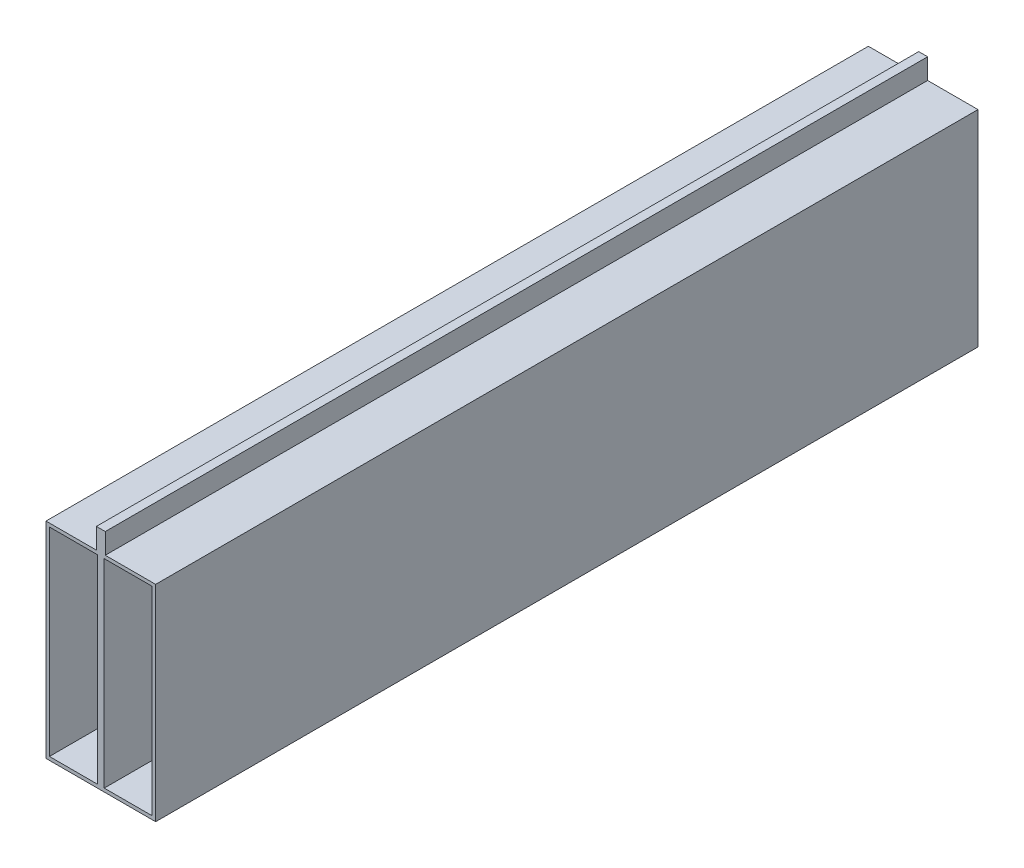
ISO-10303-21;
HEADER;
FILE_DESCRIPTION(('STEP AP214'),'2;1');
FILE_NAME('part.step','',(''),(''),'','','');
FILE_SCHEMA(('AUTOMOTIVE_DESIGN { 1 0 10303 214 1 1 1 1 }'));
ENDSEC;
DATA;
#1=APPLICATION_CONTEXT('core data for automotive mechanical design processes');
#2=APPLICATION_PROTOCOL_DEFINITION('international standard','automotive_design',2000,#1);
#3=PRODUCT_CONTEXT('',#1,'mechanical');
#4=PRODUCT('Part','Part','',(#3));
#5=PRODUCT_RELATED_PRODUCT_CATEGORY('part','',(#4));
#6=PRODUCT_DEFINITION_FORMATION('','',#4);
#7=PRODUCT_DEFINITION_CONTEXT('part definition',#1,'design');
#8=PRODUCT_DEFINITION('design','',#6,#7);
#9=PRODUCT_DEFINITION_SHAPE('','',#8);
#10=(LENGTH_UNIT() NAMED_UNIT(*) SI_UNIT(.MILLI.,.METRE.));
#11=(NAMED_UNIT(*) PLANE_ANGLE_UNIT() SI_UNIT($,.RADIAN.));
#12=(NAMED_UNIT(*) SI_UNIT($,.STERADIAN.) SOLID_ANGLE_UNIT());
#13=UNCERTAINTY_MEASURE_WITH_UNIT(LENGTH_MEASURE(1.E-05),#10,'distance_accuracy_value','');
#14=(GEOMETRIC_REPRESENTATION_CONTEXT(3) GLOBAL_UNCERTAINTY_ASSIGNED_CONTEXT((#13)) GLOBAL_UNIT_ASSIGNED_CONTEXT((#10,
#11,#12)) REPRESENTATION_CONTEXT('',''));
#15=CARTESIAN_POINT('',(0.,0.,0.));
#16=DIRECTION('',(0.,0.,1.));
#17=DIRECTION('',(1.,0.,0.));
#18=AXIS2_PLACEMENT_3D('',#15,#16,#17);
#19=CARTESIAN_POINT('',(0.,1500.,-6000.));
#20=DIRECTION('',(0.,1.,0.));
#21=DIRECTION('',(-1.,0.,0.));
#22=AXIS2_PLACEMENT_3D('',#19,#20,#21);
#23=PLANE('',#22);
#24=DIRECTION('',(-1.,0.,0.));
#25=VECTOR('',#24,1.);
#26=CARTESIAN_POINT('',(0.,1500.,-6000.));
#27=LINE('',#26,#25);
#28=CARTESIAN_POINT('',(800.,1500.,-6000.));
#29=VERTEX_POINT('',#28);
#30=CARTESIAN_POINT('',(432.5,1500.,-6000.));
#31=VERTEX_POINT('',#30);
#32=EDGE_CURVE('E257',#29,#31,#27,.T.);
#33=ORIENTED_EDGE('',*,*,#32,.T.);
#34=DIRECTION('',(0.,0.,1.));
#35=VECTOR('',#34,1.);
#36=CARTESIAN_POINT('',(432.5,1500.,-6163.47782724272));
#37=LINE('',#36,#35);
#38=CARTESIAN_POINT('',(432.5,1500.,0.));
#39=VERTEX_POINT('',#38);
#40=EDGE_CURVE('E179',#31,#39,#37,.T.);
#41=ORIENTED_EDGE('',*,*,#40,.T.);
#42=DIRECTION('',(-1.,0.,0.));
#43=VECTOR('',#42,1.);
#44=CARTESIAN_POINT('',(0.,1500.,0.));
#45=LINE('',#44,#43);
#46=CARTESIAN_POINT('',(800.,1500.,0.));
#47=VERTEX_POINT('',#46);
#48=EDGE_CURVE('E251',#47,#39,#45,.T.);
#49=ORIENTED_EDGE('',*,*,#48,.F.);
#50=DIRECTION('',(0.,0.,1.));
#51=VECTOR('',#50,1.);
#52=CARTESIAN_POINT('',(800.,1500.,-6000.));
#53=LINE('',#52,#51);
#54=EDGE_CURVE('E42',#29,#47,#53,.T.);
#55=ORIENTED_EDGE('',*,*,#54,.F.);
#56=EDGE_LOOP('',(#33,#41,#49,#55));
#57=FACE_BOUND('',#56,.T.);
#58=ADVANCED_FACE('F33',(#57),#23,.T.);
#59=CARTESIAN_POINT('',(0.,0.,-6000.));
#60=DIRECTION('',(-1.,0.,0.));
#61=DIRECTION('',(0.,0.,1.));
#62=AXIS2_PLACEMENT_3D('',#59,#60,#61);
#63=PLANE('',#62);
#64=DIRECTION('',(0.,-1.,0.));
#65=VECTOR('',#64,1.);
#66=CARTESIAN_POINT('',(0.,0.,0.));
#67=LINE('',#66,#65);
#68=CARTESIAN_POINT('',(0.,1500.,0.));
#69=VERTEX_POINT('',#68);
#70=CARTESIAN_POINT('',(0.,0.,0.));
#71=VERTEX_POINT('',#70);
#72=EDGE_CURVE('E240',#69,#71,#67,.T.);
#73=ORIENTED_EDGE('',*,*,#72,.F.);
#74=DIRECTION('',(0.,0.,1.));
#75=VECTOR('',#74,1.);
#76=CARTESIAN_POINT('',(0.,1500.,-6000.));
#77=LINE('',#76,#75);
#78=CARTESIAN_POINT('',(0.,1500.,-6000.));
#79=VERTEX_POINT('',#78);
#80=EDGE_CURVE('E11',#79,#69,#77,.T.);
#81=ORIENTED_EDGE('',*,*,#80,.F.);
#82=DIRECTION('',(0.,-1.,0.));
#83=VECTOR('',#82,1.);
#84=CARTESIAN_POINT('',(0.,0.,-6000.));
#85=LINE('',#84,#83);
#86=CARTESIAN_POINT('',(0.,0.,-6000.));
#87=VERTEX_POINT('',#86);
#88=EDGE_CURVE('E247',#79,#87,#85,.T.);
#89=ORIENTED_EDGE('',*,*,#88,.T.);
#90=DIRECTION('',(0.,0.,1.));
#91=VECTOR('',#90,1.);
#92=CARTESIAN_POINT('',(0.,0.,-6000.));
#93=LINE('',#92,#91);
#94=EDGE_CURVE('E37',#87,#71,#93,.T.);
#95=ORIENTED_EDGE('',*,*,#94,.T.);
#96=EDGE_LOOP('',(#73,#81,#89,#95));
#97=FACE_BOUND('',#96,.T.);
#98=ADVANCED_FACE('F35',(#97),#63,.T.);
#99=DIRECTION('',(0.,0.,1.));
#100=VECTOR('',#99,1.);
#101=CARTESIAN_POINT('',(367.5,1500.,-6163.47782724272));
#102=LINE('',#101,#100);
#103=CARTESIAN_POINT('',(367.5,1500.,-6000.));
#104=VERTEX_POINT('',#103);
#105=CARTESIAN_POINT('',(367.5,1500.,0.));
#106=VERTEX_POINT('',#105);
#107=EDGE_CURVE('E158',#104,#106,#102,.T.);
#108=ORIENTED_EDGE('',*,*,#107,.F.);
#109=EDGE_CURVE('E155',#104,#79,#27,.T.);
#110=ORIENTED_EDGE('',*,*,#109,.T.);
#111=ORIENTED_EDGE('',*,*,#80,.T.);
#112=EDGE_CURVE('E268',#106,#69,#45,.T.);
#113=ORIENTED_EDGE('',*,*,#112,.F.);
#114=EDGE_LOOP('',(#108,#110,#111,#113));
#115=FACE_BOUND('',#114,.T.);
#116=ADVANCED_FACE('F284',(#115),#23,.T.);
#117=CARTESIAN_POINT('',(800.,0.,-6000.));
#118=DIRECTION('',(1.,0.,0.));
#119=DIRECTION('',(0.,0.,-1.));
#120=AXIS2_PLACEMENT_3D('',#117,#118,#119);
#121=PLANE('',#120);
#122=DIRECTION('',(0.,1.,0.));
#123=VECTOR('',#122,1.);
#124=CARTESIAN_POINT('',(800.,0.,0.));
#125=LINE('',#124,#123);
#126=CARTESIAN_POINT('',(800.,0.,0.));
#127=VERTEX_POINT('',#126);
#128=EDGE_CURVE('E265',#127,#47,#125,.T.);
#129=ORIENTED_EDGE('',*,*,#128,.F.);
#130=DIRECTION('',(0.,0.,1.));
#131=VECTOR('',#130,1.);
#132=CARTESIAN_POINT('',(800.,0.,-6000.));
#133=LINE('',#132,#131);
#134=CARTESIAN_POINT('',(800.,0.,-6000.));
#135=VERTEX_POINT('',#134);
#136=EDGE_CURVE('E271',#135,#127,#133,.T.);
#137=ORIENTED_EDGE('',*,*,#136,.F.);
#138=DIRECTION('',(0.,1.,0.));
#139=VECTOR('',#138,1.);
#140=CARTESIAN_POINT('',(800.,0.,-6000.));
#141=LINE('',#140,#139);
#142=EDGE_CURVE('E254',#135,#29,#141,.T.);
#143=ORIENTED_EDGE('',*,*,#142,.T.);
#144=ORIENTED_EDGE('',*,*,#54,.T.);
#145=EDGE_LOOP('',(#129,#137,#143,#144));
#146=FACE_BOUND('',#145,.T.);
#147=ADVANCED_FACE('F288',(#146),#121,.T.);
#148=CARTESIAN_POINT('',(0.,0.,-6000.));
#149=DIRECTION('',(0.,-1.,0.));
#150=DIRECTION('',(0.,0.,-1.));
#151=AXIS2_PLACEMENT_3D('',#148,#149,#150);
#152=PLANE('',#151);
#153=DIRECTION('',(1.,0.,0.));
#154=VECTOR('',#153,1.);
#155=CARTESIAN_POINT('',(0.,0.,0.));
#156=LINE('',#155,#154);
#157=EDGE_CURVE('E262',#71,#127,#156,.T.);
#158=ORIENTED_EDGE('',*,*,#157,.F.);
#159=ORIENTED_EDGE('',*,*,#94,.F.);
#160=DIRECTION('',(1.,0.,0.));
#161=VECTOR('',#160,1.);
#162=CARTESIAN_POINT('',(0.,0.,-6000.));
#163=LINE('',#162,#161);
#164=EDGE_CURVE('E250',#87,#135,#163,.T.);
#165=ORIENTED_EDGE('',*,*,#164,.T.);
#166=ORIENTED_EDGE('',*,*,#136,.T.);
#167=EDGE_LOOP('',(#158,#159,#165,#166));
#168=FACE_BOUND('',#167,.T.);
#169=ADVANCED_FACE('F279',(#168),#152,.T.);
#170=CARTESIAN_POINT('',(0.,0.,-6000.));
#171=DIRECTION('',(0.,0.,-1.));
#172=DIRECTION('',(-1.,0.,0.));
#173=AXIS2_PLACEMENT_3D('',#170,#171,#172);
#174=PLANE('',#173);
#175=DIRECTION('',(-1.,0.,0.));
#176=VECTOR('',#175,1.);
#177=CARTESIAN_POINT('',(775.,1475.,-6000.));
#178=LINE('',#177,#176);
#179=CARTESIAN_POINT('',(775.,1475.,-6000.));
#180=VERTEX_POINT('',#179);
#181=CARTESIAN_POINT('',(425.,1475.,-6000.));
#182=VERTEX_POINT('',#181);
#183=EDGE_CURVE('E185',#180,#182,#178,.T.);
#184=ORIENTED_EDGE('',*,*,#183,.T.);
#185=DIRECTION('',(0.,-1.,0.));
#186=VECTOR('',#185,1.);
#187=CARTESIAN_POINT('',(425.,1475.,-6000.));
#188=LINE('',#187,#186);
#189=CARTESIAN_POINT('',(425.,25.,-6000.));
#190=VERTEX_POINT('',#189);
#191=EDGE_CURVE('E188',#182,#190,#188,.T.);
#192=ORIENTED_EDGE('',*,*,#191,.T.);
#193=DIRECTION('',(1.,0.,0.));
#194=VECTOR('',#193,1.);
#195=CARTESIAN_POINT('',(425.,25.,-6000.));
#196=LINE('',#195,#194);
#197=CARTESIAN_POINT('',(775.,25.,-6000.));
#198=VERTEX_POINT('',#197);
#199=EDGE_CURVE('E58',#190,#198,#196,.T.);
#200=ORIENTED_EDGE('',*,*,#199,.T.);
#201=DIRECTION('',(0.,1.,0.));
#202=VECTOR('',#201,1.);
#203=CARTESIAN_POINT('',(775.,25.,-6000.));
#204=LINE('',#203,#202);
#205=EDGE_CURVE('E193',#198,#180,#204,.T.);
#206=ORIENTED_EDGE('',*,*,#205,.T.);
#207=EDGE_LOOP('',(#184,#192,#200,#206));
#208=FACE_BOUND('',#207,.T.);
#209=DIRECTION('',(0.,-1.,0.));
#210=VECTOR('',#209,1.);
#211=CARTESIAN_POINT('',(25.,1475.,-6000.));
#212=LINE('',#211,#210);
#213=CARTESIAN_POINT('',(25.,1475.,-6000.));
#214=VERTEX_POINT('',#213);
#215=CARTESIAN_POINT('',(25.0000000000001,25.,-6000.));
#216=VERTEX_POINT('',#215);
#217=EDGE_CURVE('E215',#214,#216,#212,.T.);
#218=ORIENTED_EDGE('',*,*,#217,.T.);
#219=DIRECTION('',(1.,0.,0.));
#220=VECTOR('',#219,1.);
#221=CARTESIAN_POINT('',(25.0000000000001,25.,-6000.));
#222=LINE('',#221,#220);
#223=CARTESIAN_POINT('',(375.,25.,-6000.));
#224=VERTEX_POINT('',#223);
#225=EDGE_CURVE('E218',#216,#224,#222,.T.);
#226=ORIENTED_EDGE('',*,*,#225,.T.);
#227=DIRECTION('',(0.,1.,0.));
#228=VECTOR('',#227,1.);
#229=CARTESIAN_POINT('',(375.,1475.,-6000.));
#230=LINE('',#229,#228);
#231=CARTESIAN_POINT('',(375.,1475.,-6000.));
#232=VERTEX_POINT('',#231);
#233=EDGE_CURVE('E222',#224,#232,#230,.T.);
#234=ORIENTED_EDGE('',*,*,#233,.T.);
#235=DIRECTION('',(-1.,0.,0.));
#236=VECTOR('',#235,1.);
#237=CARTESIAN_POINT('',(25.,1475.,-6000.));
#238=LINE('',#237,#236);
#239=EDGE_CURVE('E225',#232,#214,#238,.T.);
#240=ORIENTED_EDGE('',*,*,#239,.T.);
#241=EDGE_LOOP('',(#218,#226,#234,#240));
#242=FACE_BOUND('',#241,.T.);
#243=ORIENTED_EDGE('',*,*,#88,.F.);
#244=ORIENTED_EDGE('',*,*,#109,.F.);
#245=DIRECTION('',(0.,-1.,0.));
#246=VECTOR('',#245,1.);
#247=CARTESIAN_POINT('',(367.5,1650.,-6000.));
#248=LINE('',#247,#246);
#249=CARTESIAN_POINT('',(367.5,1650.,-6000.));
#250=VERTEX_POINT('',#249);
#251=EDGE_CURVE('E148',#250,#104,#248,.T.);
#252=ORIENTED_EDGE('',*,*,#251,.F.);
#253=DIRECTION('',(-1.,0.,0.));
#254=VECTOR('',#253,1.);
#255=CARTESIAN_POINT('',(432.5,1650.,-6000.));
#256=LINE('',#255,#254);
#257=CARTESIAN_POINT('',(432.5,1650.,-6000.));
#258=VERTEX_POINT('',#257);
#259=EDGE_CURVE('E153',#258,#250,#256,.T.);
#260=ORIENTED_EDGE('',*,*,#259,.F.);
#261=DIRECTION('',(0.,1.,0.));
#262=VECTOR('',#261,1.);
#263=CARTESIAN_POINT('',(432.5,1500.,-6000.));
#264=LINE('',#263,#262);
#265=EDGE_CURVE('E178',#31,#258,#264,.T.);
#266=ORIENTED_EDGE('',*,*,#265,.F.);
#267=ORIENTED_EDGE('',*,*,#32,.F.);
#268=ORIENTED_EDGE('',*,*,#142,.F.);
#269=ORIENTED_EDGE('',*,*,#164,.F.);
#270=EDGE_LOOP('',(#243,#244,#252,#260,#266,#267,#268,#269));
#271=FACE_BOUND('',#270,.T.);
#272=ADVANCED_FACE('F151',(#208,#242,#271),#174,.T.);
#273=CARTESIAN_POINT('',(0.,0.,0.));
#274=DIRECTION('',(0.,0.,-1.));
#275=DIRECTION('',(-1.,0.,0.));
#276=AXIS2_PLACEMENT_3D('',#273,#274,#275);
#277=PLANE('',#276);
#278=DIRECTION('',(0.,-1.,0.));
#279=VECTOR('',#278,1.);
#280=CARTESIAN_POINT('',(425.,1475.,0.));
#281=LINE('',#280,#279);
#282=CARTESIAN_POINT('',(425.,1475.,0.));
#283=VERTEX_POINT('',#282);
#284=CARTESIAN_POINT('',(425.,25.,0.));
#285=VERTEX_POINT('',#284);
#286=EDGE_CURVE('E198',#283,#285,#281,.T.);
#287=ORIENTED_EDGE('',*,*,#286,.F.);
#288=DIRECTION('',(-1.,0.,0.));
#289=VECTOR('',#288,1.);
#290=CARTESIAN_POINT('',(775.,1475.,0.));
#291=LINE('',#290,#289);
#292=CARTESIAN_POINT('',(775.,1475.,0.));
#293=VERTEX_POINT('',#292);
#294=EDGE_CURVE('E184',#293,#283,#291,.T.);
#295=ORIENTED_EDGE('',*,*,#294,.F.);
#296=DIRECTION('',(0.,1.,0.));
#297=VECTOR('',#296,1.);
#298=CARTESIAN_POINT('',(775.,25.,0.));
#299=LINE('',#298,#297);
#300=CARTESIAN_POINT('',(775.,25.,0.));
#301=VERTEX_POINT('',#300);
#302=EDGE_CURVE('E189',#301,#293,#299,.T.);
#303=ORIENTED_EDGE('',*,*,#302,.F.);
#304=DIRECTION('',(1.,0.,0.));
#305=VECTOR('',#304,1.);
#306=CARTESIAN_POINT('',(425.,25.,0.));
#307=LINE('',#306,#305);
#308=EDGE_CURVE('E201',#285,#301,#307,.T.);
#309=ORIENTED_EDGE('',*,*,#308,.F.);
#310=EDGE_LOOP('',(#287,#295,#303,#309));
#311=FACE_BOUND('',#310,.T.);
#312=DIRECTION('',(1.,0.,0.));
#313=VECTOR('',#312,1.);
#314=CARTESIAN_POINT('',(25.0000000000001,25.,0.));
#315=LINE('',#314,#313);
#316=CARTESIAN_POINT('',(25.0000000000001,25.,0.));
#317=VERTEX_POINT('',#316);
#318=CARTESIAN_POINT('',(375.,25.,0.));
#319=VERTEX_POINT('',#318);
#320=EDGE_CURVE('E230',#317,#319,#315,.T.);
#321=ORIENTED_EDGE('',*,*,#320,.F.);
#322=DIRECTION('',(0.,-1.,0.));
#323=VECTOR('',#322,1.);
#324=CARTESIAN_POINT('',(25.,1475.,0.));
#325=LINE('',#324,#323);
#326=CARTESIAN_POINT('',(25.,1475.,0.));
#327=VERTEX_POINT('',#326);
#328=EDGE_CURVE('E208',#327,#317,#325,.T.);
#329=ORIENTED_EDGE('',*,*,#328,.F.);
#330=DIRECTION('',(-1.,0.,0.));
#331=VECTOR('',#330,1.);
#332=CARTESIAN_POINT('',(25.,1475.,0.));
#333=LINE('',#332,#331);
#334=CARTESIAN_POINT('',(375.,1475.,0.));
#335=VERTEX_POINT('',#334);
#336=EDGE_CURVE('E219',#335,#327,#333,.T.);
#337=ORIENTED_EDGE('',*,*,#336,.F.);
#338=DIRECTION('',(0.,1.,0.));
#339=VECTOR('',#338,1.);
#340=CARTESIAN_POINT('',(375.,1475.,0.));
#341=LINE('',#340,#339);
#342=EDGE_CURVE('E233',#319,#335,#341,.T.);
#343=ORIENTED_EDGE('',*,*,#342,.F.);
#344=EDGE_LOOP('',(#321,#329,#337,#343));
#345=FACE_BOUND('',#344,.T.);
#346=ORIENTED_EDGE('',*,*,#72,.T.);
#347=ORIENTED_EDGE('',*,*,#157,.T.);
#348=ORIENTED_EDGE('',*,*,#128,.T.);
#349=ORIENTED_EDGE('',*,*,#48,.T.);
#350=DIRECTION('',(0.,1.,0.));
#351=VECTOR('',#350,1.);
#352=CARTESIAN_POINT('',(432.5,1500.,0.));
#353=LINE('',#352,#351);
#354=CARTESIAN_POINT('',(432.5,1650.,0.));
#355=VERTEX_POINT('',#354);
#356=EDGE_CURVE('E50',#39,#355,#353,.T.);
#357=ORIENTED_EDGE('',*,*,#356,.T.);
#358=DIRECTION('',(-1.,0.,0.));
#359=VECTOR('',#358,1.);
#360=CARTESIAN_POINT('',(432.5,1650.,0.));
#361=LINE('',#360,#359);
#362=CARTESIAN_POINT('',(367.5,1650.,0.));
#363=VERTEX_POINT('',#362);
#364=EDGE_CURVE('E173',#355,#363,#361,.T.);
#365=ORIENTED_EDGE('',*,*,#364,.T.);
#366=DIRECTION('',(0.,-1.,0.));
#367=VECTOR('',#366,1.);
#368=CARTESIAN_POINT('',(367.5,1650.,0.));
#369=LINE('',#368,#367);
#370=EDGE_CURVE('E164',#363,#106,#369,.T.);
#371=ORIENTED_EDGE('',*,*,#370,.T.);
#372=ORIENTED_EDGE('',*,*,#112,.T.);
#373=EDGE_LOOP('',(#346,#347,#348,#349,#357,#365,#371,#372));
#374=FACE_BOUND('',#373,.T.);
#375=ADVANCED_FACE('F281',(#311,#345,#374),#277,.F.);
#376=CARTESIAN_POINT('',(25.,1475.,-6000.));
#377=DIRECTION('',(-1.,0.,0.));
#378=DIRECTION('',(0.,-1.,0.));
#379=AXIS2_PLACEMENT_3D('',#376,#377,#378);
#380=PLANE('',#379);
#381=ORIENTED_EDGE('',*,*,#328,.T.);
#382=DIRECTION('',(0.,0.,1.));
#383=VECTOR('',#382,1.);
#384=CARTESIAN_POINT('',(25.0000000000001,25.,-6000.));
#385=LINE('',#384,#383);
#386=EDGE_CURVE('E228',#216,#317,#385,.T.);
#387=ORIENTED_EDGE('',*,*,#386,.F.);
#388=ORIENTED_EDGE('',*,*,#217,.F.);
#389=DIRECTION('',(0.,0.,1.));
#390=VECTOR('',#389,1.);
#391=CARTESIAN_POINT('',(25.,1475.,-6000.));
#392=LINE('',#391,#390);
#393=EDGE_CURVE('E238',#214,#327,#392,.T.);
#394=ORIENTED_EDGE('',*,*,#393,.T.);
#395=EDGE_LOOP('',(#381,#387,#388,#394));
#396=FACE_BOUND('',#395,.T.);
#397=ADVANCED_FACE('F320',(#396),#380,.F.);
#398=CARTESIAN_POINT('',(25.,1475.,-6000.));
#399=DIRECTION('',(0.,1.,0.));
#400=DIRECTION('',(0.,0.,1.));
#401=AXIS2_PLACEMENT_3D('',#398,#399,#400);
#402=PLANE('',#401);
#403=ORIENTED_EDGE('',*,*,#336,.T.);
#404=ORIENTED_EDGE('',*,*,#393,.F.);
#405=ORIENTED_EDGE('',*,*,#239,.F.);
#406=DIRECTION('',(0.,0.,1.));
#407=VECTOR('',#406,1.);
#408=CARTESIAN_POINT('',(375.,1475.,-6000.));
#409=LINE('',#408,#407);
#410=EDGE_CURVE('E241',#232,#335,#409,.T.);
#411=ORIENTED_EDGE('',*,*,#410,.T.);
#412=EDGE_LOOP('',(#403,#404,#405,#411));
#413=FACE_BOUND('',#412,.T.);
#414=ADVANCED_FACE('F326',(#413),#402,.F.);
#415=CARTESIAN_POINT('',(375.,1475.,-6000.));
#416=DIRECTION('',(1.,0.,0.));
#417=DIRECTION('',(0.,1.,0.));
#418=AXIS2_PLACEMENT_3D('',#415,#416,#417);
#419=PLANE('',#418);
#420=ORIENTED_EDGE('',*,*,#342,.T.);
#421=ORIENTED_EDGE('',*,*,#410,.F.);
#422=ORIENTED_EDGE('',*,*,#233,.F.);
#423=DIRECTION('',(0.,0.,1.));
#424=VECTOR('',#423,1.);
#425=CARTESIAN_POINT('',(375.,25.,-6000.));
#426=LINE('',#425,#424);
#427=EDGE_CURVE('E243',#224,#319,#426,.T.);
#428=ORIENTED_EDGE('',*,*,#427,.T.);
#429=EDGE_LOOP('',(#420,#421,#422,#428));
#430=FACE_BOUND('',#429,.T.);
#431=ADVANCED_FACE('F332',(#430),#419,.F.);
#432=CARTESIAN_POINT('',(25.0000000000001,25.,-6000.));
#433=DIRECTION('',(0.,-1.,0.));
#434=DIRECTION('',(0.,0.,-1.));
#435=AXIS2_PLACEMENT_3D('',#432,#433,#434);
#436=PLANE('',#435);
#437=ORIENTED_EDGE('',*,*,#320,.T.);
#438=ORIENTED_EDGE('',*,*,#427,.F.);
#439=ORIENTED_EDGE('',*,*,#225,.F.);
#440=ORIENTED_EDGE('',*,*,#386,.T.);
#441=EDGE_LOOP('',(#437,#438,#439,#440));
#442=FACE_BOUND('',#441,.T.);
#443=ADVANCED_FACE('F328',(#442),#436,.F.);
#444=CARTESIAN_POINT('',(775.,1475.,-6000.));
#445=DIRECTION('',(0.,1.,0.));
#446=DIRECTION('',(0.,0.,1.));
#447=AXIS2_PLACEMENT_3D('',#444,#445,#446);
#448=PLANE('',#447);
#449=ORIENTED_EDGE('',*,*,#294,.T.);
#450=DIRECTION('',(0.,0.,1.));
#451=VECTOR('',#450,1.);
#452=CARTESIAN_POINT('',(425.,1475.,-6000.));
#453=LINE('',#452,#451);
#454=EDGE_CURVE('E196',#182,#283,#453,.T.);
#455=ORIENTED_EDGE('',*,*,#454,.F.);
#456=ORIENTED_EDGE('',*,*,#183,.F.);
#457=DIRECTION('',(0.,0.,1.));
#458=VECTOR('',#457,1.);
#459=CARTESIAN_POINT('',(775.,1475.,-6000.));
#460=LINE('',#459,#458);
#461=EDGE_CURVE('E206',#180,#293,#460,.T.);
#462=ORIENTED_EDGE('',*,*,#461,.T.);
#463=EDGE_LOOP('',(#449,#455,#456,#462));
#464=FACE_BOUND('',#463,.T.);
#465=ADVANCED_FACE('F331',(#464),#448,.F.);
#466=CARTESIAN_POINT('',(775.,25.,-6000.));
#467=DIRECTION('',(1.,0.,0.));
#468=DIRECTION('',(0.,0.,-1.));
#469=AXIS2_PLACEMENT_3D('',#466,#467,#468);
#470=PLANE('',#469);
#471=ORIENTED_EDGE('',*,*,#302,.T.);
#472=ORIENTED_EDGE('',*,*,#461,.F.);
#473=ORIENTED_EDGE('',*,*,#205,.F.);
#474=DIRECTION('',(0.,0.,1.));
#475=VECTOR('',#474,1.);
#476=CARTESIAN_POINT('',(775.,25.,-6000.));
#477=LINE('',#476,#475);
#478=EDGE_CURVE('E209',#198,#301,#477,.T.);
#479=ORIENTED_EDGE('',*,*,#478,.T.);
#480=EDGE_LOOP('',(#471,#472,#473,#479));
#481=FACE_BOUND('',#480,.T.);
#482=ADVANCED_FACE('F342',(#481),#470,.F.);
#483=CARTESIAN_POINT('',(425.,25.,-6000.));
#484=DIRECTION('',(0.,-1.,0.));
#485=DIRECTION('',(0.,0.,-1.));
#486=AXIS2_PLACEMENT_3D('',#483,#484,#485);
#487=PLANE('',#486);
#488=ORIENTED_EDGE('',*,*,#308,.T.);
#489=ORIENTED_EDGE('',*,*,#478,.F.);
#490=ORIENTED_EDGE('',*,*,#199,.F.);
#491=DIRECTION('',(0.,0.,1.));
#492=VECTOR('',#491,1.);
#493=CARTESIAN_POINT('',(425.,25.,-6000.));
#494=LINE('',#493,#492);
#495=EDGE_CURVE('E211',#190,#285,#494,.T.);
#496=ORIENTED_EDGE('',*,*,#495,.T.);
#497=EDGE_LOOP('',(#488,#489,#490,#496));
#498=FACE_BOUND('',#497,.T.);
#499=ADVANCED_FACE('F347',(#498),#487,.F.);
#500=CARTESIAN_POINT('',(425.,1475.,-6000.));
#501=DIRECTION('',(-1.,0.,0.));
#502=DIRECTION('',(0.,-1.,0.));
#503=AXIS2_PLACEMENT_3D('',#500,#501,#502);
#504=PLANE('',#503);
#505=ORIENTED_EDGE('',*,*,#286,.T.);
#506=ORIENTED_EDGE('',*,*,#495,.F.);
#507=ORIENTED_EDGE('',*,*,#191,.F.);
#508=ORIENTED_EDGE('',*,*,#454,.T.);
#509=EDGE_LOOP('',(#505,#506,#507,#508));
#510=FACE_BOUND('',#509,.T.);
#511=ADVANCED_FACE('F344',(#510),#504,.F.);
#512=CARTESIAN_POINT('',(432.5,1650.,-6163.47782724272));
#513=DIRECTION('',(0.,1.,0.));
#514=DIRECTION('',(0.,0.,1.));
#515=AXIS2_PLACEMENT_3D('',#512,#513,#514);
#516=PLANE('',#515);
#517=DIRECTION('',(0.,0.,1.));
#518=VECTOR('',#517,1.);
#519=CARTESIAN_POINT('',(432.5,1650.,-6163.47782724272));
#520=LINE('',#519,#518);
#521=EDGE_CURVE('E171',#258,#355,#520,.T.);
#522=ORIENTED_EDGE('',*,*,#521,.F.);
#523=ORIENTED_EDGE('',*,*,#259,.T.);
#524=DIRECTION('',(0.,0.,1.));
#525=VECTOR('',#524,1.);
#526=CARTESIAN_POINT('',(367.5,1650.,-6163.47782724272));
#527=LINE('',#526,#525);
#528=EDGE_CURVE('E159',#250,#363,#527,.T.);
#529=ORIENTED_EDGE('',*,*,#528,.T.);
#530=ORIENTED_EDGE('',*,*,#364,.F.);
#531=EDGE_LOOP('',(#522,#523,#529,#530));
#532=FACE_BOUND('',#531,.T.);
#533=ADVANCED_FACE('F170',(#532),#516,.T.);
#534=CARTESIAN_POINT('',(367.5,1650.,-6163.47782724272));
#535=DIRECTION('',(-1.,0.,0.));
#536=DIRECTION('',(0.,-1.,0.));
#537=AXIS2_PLACEMENT_3D('',#534,#535,#536);
#538=PLANE('',#537);
#539=ORIENTED_EDGE('',*,*,#528,.F.);
#540=ORIENTED_EDGE('',*,*,#251,.T.);
#541=ORIENTED_EDGE('',*,*,#107,.T.);
#542=ORIENTED_EDGE('',*,*,#370,.F.);
#543=EDGE_LOOP('',(#539,#540,#541,#542));
#544=FACE_BOUND('',#543,.T.);
#545=ADVANCED_FACE('F162',(#544),#538,.T.);
#546=CARTESIAN_POINT('',(432.5,1500.,-6163.47782724272));
#547=DIRECTION('',(1.,0.,0.));
#548=DIRECTION('',(0.,1.,0.));
#549=AXIS2_PLACEMENT_3D('',#546,#547,#548);
#550=PLANE('',#549);
#551=ORIENTED_EDGE('',*,*,#40,.F.);
#552=ORIENTED_EDGE('',*,*,#265,.T.);
#553=ORIENTED_EDGE('',*,*,#521,.T.);
#554=ORIENTED_EDGE('',*,*,#356,.F.);
#555=EDGE_LOOP('',(#551,#552,#553,#554));
#556=FACE_BOUND('',#555,.T.);
#557=ADVANCED_FACE('F291',(#556),#550,.T.);
#558=CLOSED_SHELL('',(#58,#98,#116,#147,#169,#272,#375,#397,#414,#431,#443,#465,#482,#499,#511,
#533,#545,#557));
#559=MANIFOLD_SOLID_BREP('B2',#558);
#560=ADVANCED_BREP_SHAPE_REPRESENTATION('',(#18,#559),#14);
#561=SHAPE_DEFINITION_REPRESENTATION(#9,#560);
ENDSEC;
END-ISO-10303-21;
